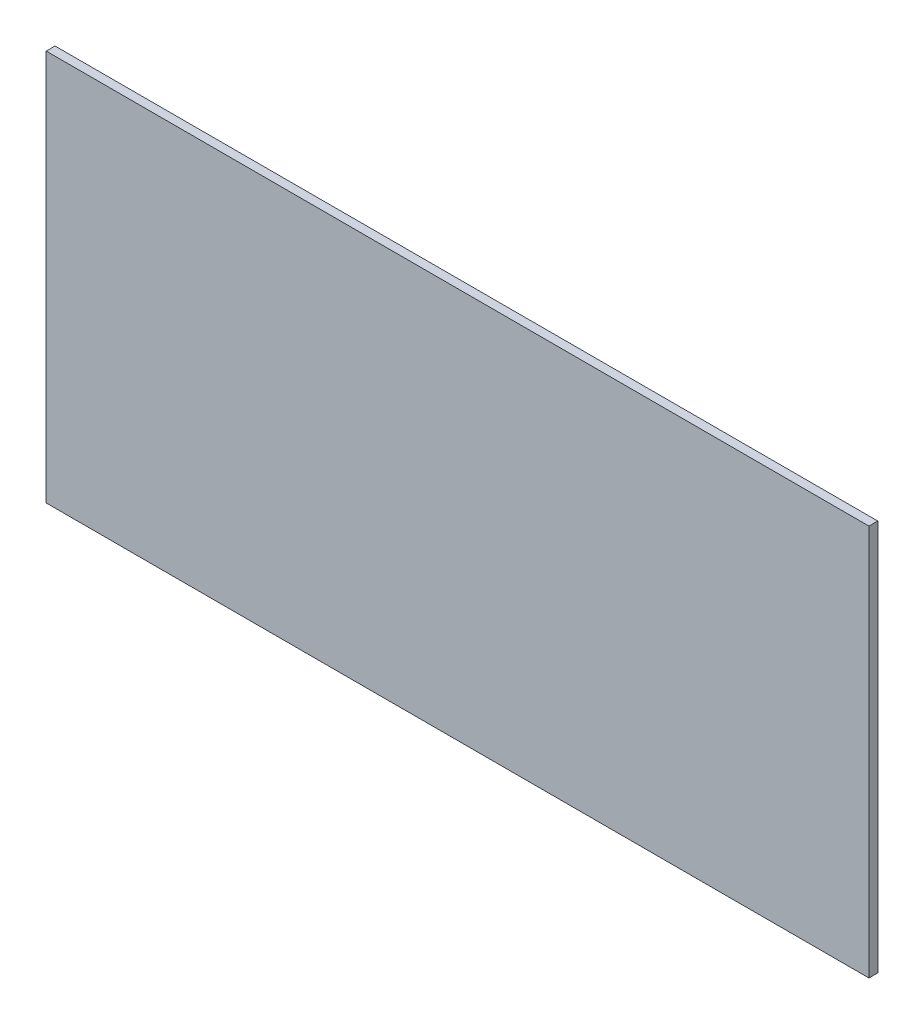
ISO-10303-21;
HEADER;
FILE_DESCRIPTION(('STEP AP214'),'2;1');
FILE_NAME('part.step','',(''),(''),'','','');
FILE_SCHEMA(('AUTOMOTIVE_DESIGN { 1 0 10303 214 1 1 1 1 }'));
ENDSEC;
DATA;
#1=APPLICATION_CONTEXT('core data for automotive mechanical design processes');
#2=APPLICATION_PROTOCOL_DEFINITION('international standard','automotive_design',2000,#1);
#3=PRODUCT_CONTEXT('',#1,'mechanical');
#4=PRODUCT('Part','Part','',(#3));
#5=PRODUCT_RELATED_PRODUCT_CATEGORY('part','',(#4));
#6=PRODUCT_DEFINITION_FORMATION('','',#4);
#7=PRODUCT_DEFINITION_CONTEXT('part definition',#1,'design');
#8=PRODUCT_DEFINITION('design','',#6,#7);
#9=PRODUCT_DEFINITION_SHAPE('','',#8);
#10=(LENGTH_UNIT() NAMED_UNIT(*) SI_UNIT(.MILLI.,.METRE.));
#11=(NAMED_UNIT(*) PLANE_ANGLE_UNIT() SI_UNIT($,.RADIAN.));
#12=(NAMED_UNIT(*) SI_UNIT($,.STERADIAN.) SOLID_ANGLE_UNIT());
#13=UNCERTAINTY_MEASURE_WITH_UNIT(LENGTH_MEASURE(1.E-05),#10,'distance_accuracy_value','');
#14=(GEOMETRIC_REPRESENTATION_CONTEXT(3) GLOBAL_UNCERTAINTY_ASSIGNED_CONTEXT((#13)) GLOBAL_UNIT_ASSIGNED_CONTEXT((#10,
#11,#12)) REPRESENTATION_CONTEXT('',''));
#15=CARTESIAN_POINT('',(0.,0.,0.));
#16=DIRECTION('',(0.,0.,1.));
#17=DIRECTION('',(1.,0.,0.));
#18=AXIS2_PLACEMENT_3D('',#15,#16,#17);
#19=CARTESIAN_POINT('',(233.6,-111.125,5.));
#20=DIRECTION('',(-1.,0.,0.));
#21=DIRECTION('',(0.,0.,1.));
#22=AXIS2_PLACEMENT_3D('',#19,#20,#21);
#23=PLANE('',#22);
#24=DIRECTION('',(0.,1.,0.));
#25=VECTOR('',#24,1.);
#26=CARTESIAN_POINT('',(233.6,-111.125,0.));
#27=LINE('',#26,#25);
#28=CARTESIAN_POINT('',(233.6,-111.125,0.));
#29=VERTEX_POINT('',#28);
#30=CARTESIAN_POINT('',(233.6,111.125,0.));
#31=VERTEX_POINT('',#30);
#32=EDGE_CURVE('E96',#29,#31,#27,.T.);
#33=ORIENTED_EDGE('',*,*,#32,.T.);
#34=DIRECTION('',(0.,0.,-1.));
#35=VECTOR('',#34,1.);
#36=CARTESIAN_POINT('',(233.6,111.125,5.));
#37=LINE('',#36,#35);
#38=CARTESIAN_POINT('',(233.6,111.125,5.));
#39=VERTEX_POINT('',#38);
#40=EDGE_CURVE('E11',#39,#31,#37,.T.);
#41=ORIENTED_EDGE('',*,*,#40,.F.);
#42=DIRECTION('',(0.,1.,0.));
#43=VECTOR('',#42,1.);
#44=CARTESIAN_POINT('',(233.6,-111.125,5.));
#45=LINE('',#44,#43);
#46=CARTESIAN_POINT('',(233.6,-111.125,5.));
#47=VERTEX_POINT('',#46);
#48=EDGE_CURVE('E84',#47,#39,#45,.T.);
#49=ORIENTED_EDGE('',*,*,#48,.F.);
#50=DIRECTION('',(0.,0.,-1.));
#51=VECTOR('',#50,1.);
#52=CARTESIAN_POINT('',(233.6,-111.125,5.));
#53=LINE('',#52,#51);
#54=EDGE_CURVE('E92',#47,#29,#53,.T.);
#55=ORIENTED_EDGE('',*,*,#54,.T.);
#56=EDGE_LOOP('',(#33,#41,#49,#55));
#57=FACE_BOUND('',#56,.T.);
#58=ADVANCED_FACE('F33',(#57),#23,.F.);
#59=CARTESIAN_POINT('',(-233.6,111.125,5.));
#60=DIRECTION('',(0.,-1.,0.));
#61=DIRECTION('',(0.,0.,-1.));
#62=AXIS2_PLACEMENT_3D('',#59,#60,#61);
#63=PLANE('',#62);
#64=DIRECTION('',(-1.,0.,0.));
#65=VECTOR('',#64,1.);
#66=CARTESIAN_POINT('',(-233.6,111.125,0.));
#67=LINE('',#66,#65);
#68=CARTESIAN_POINT('',(-233.6,111.125,0.));
#69=VERTEX_POINT('',#68);
#70=EDGE_CURVE('E88',#31,#69,#67,.T.);
#71=ORIENTED_EDGE('',*,*,#70,.T.);
#72=DIRECTION('',(0.,0.,-1.));
#73=VECTOR('',#72,1.);
#74=CARTESIAN_POINT('',(-233.6,111.125,5.));
#75=LINE('',#74,#73);
#76=CARTESIAN_POINT('',(-233.6,111.125,5.));
#77=VERTEX_POINT('',#76);
#78=EDGE_CURVE('E41',#77,#69,#75,.T.);
#79=ORIENTED_EDGE('',*,*,#78,.F.);
#80=DIRECTION('',(-1.,0.,0.));
#81=VECTOR('',#80,1.);
#82=CARTESIAN_POINT('',(-233.6,111.125,5.));
#83=LINE('',#82,#81);
#84=EDGE_CURVE('E79',#39,#77,#83,.T.);
#85=ORIENTED_EDGE('',*,*,#84,.F.);
#86=ORIENTED_EDGE('',*,*,#40,.T.);
#87=EDGE_LOOP('',(#71,#79,#85,#86));
#88=FACE_BOUND('',#87,.T.);
#89=ADVANCED_FACE('F87',(#88),#63,.F.);
#90=CARTESIAN_POINT('',(-233.6,-111.125,5.));
#91=DIRECTION('',(1.,0.,0.));
#92=DIRECTION('',(0.,0.,-1.));
#93=AXIS2_PLACEMENT_3D('',#90,#91,#92);
#94=PLANE('',#93);
#95=DIRECTION('',(0.,-1.,0.));
#96=VECTOR('',#95,1.);
#97=CARTESIAN_POINT('',(-233.6,-111.125,0.));
#98=LINE('',#97,#96);
#99=CARTESIAN_POINT('',(-233.6,-111.125,0.));
#100=VERTEX_POINT('',#99);
#101=EDGE_CURVE('E66',#69,#100,#98,.T.);
#102=ORIENTED_EDGE('',*,*,#101,.T.);
#103=DIRECTION('',(0.,0.,-1.));
#104=VECTOR('',#103,1.);
#105=CARTESIAN_POINT('',(-233.6,-111.125,5.));
#106=LINE('',#105,#104);
#107=CARTESIAN_POINT('',(-233.6,-111.125,5.));
#108=VERTEX_POINT('',#107);
#109=EDGE_CURVE('E89',#108,#100,#106,.T.);
#110=ORIENTED_EDGE('',*,*,#109,.F.);
#111=DIRECTION('',(0.,-1.,0.));
#112=VECTOR('',#111,1.);
#113=CARTESIAN_POINT('',(-233.6,-111.125,5.));
#114=LINE('',#113,#112);
#115=EDGE_CURVE('E82',#77,#108,#114,.T.);
#116=ORIENTED_EDGE('',*,*,#115,.F.);
#117=ORIENTED_EDGE('',*,*,#78,.T.);
#118=EDGE_LOOP('',(#102,#110,#116,#117));
#119=FACE_BOUND('',#118,.T.);
#120=ADVANCED_FACE('F90',(#119),#94,.F.);
#121=CARTESIAN_POINT('',(-233.6,-111.125,5.));
#122=DIRECTION('',(0.,1.,0.));
#123=DIRECTION('',(0.,0.,1.));
#124=AXIS2_PLACEMENT_3D('',#121,#122,#123);
#125=PLANE('',#124);
#126=DIRECTION('',(1.,0.,0.));
#127=VECTOR('',#126,1.);
#128=CARTESIAN_POINT('',(-233.6,-111.125,0.));
#129=LINE('',#128,#127);
#130=EDGE_CURVE('E72',#100,#29,#129,.T.);
#131=ORIENTED_EDGE('',*,*,#130,.T.);
#132=ORIENTED_EDGE('',*,*,#54,.F.);
#133=DIRECTION('',(1.,0.,0.));
#134=VECTOR('',#133,1.);
#135=CARTESIAN_POINT('',(-233.6,-111.125,5.));
#136=LINE('',#135,#134);
#137=EDGE_CURVE('E49',#108,#47,#136,.T.);
#138=ORIENTED_EDGE('',*,*,#137,.F.);
#139=ORIENTED_EDGE('',*,*,#109,.T.);
#140=EDGE_LOOP('',(#131,#132,#138,#139));
#141=FACE_BOUND('',#140,.T.);
#142=ADVANCED_FACE('F103',(#141),#125,.F.);
#143=CARTESIAN_POINT('',(0.,0.,5.));
#144=DIRECTION('',(0.,0.,-1.));
#145=DIRECTION('',(-1.,0.,0.));
#146=AXIS2_PLACEMENT_3D('',#143,#144,#145);
#147=PLANE('',#146);
#148=ORIENTED_EDGE('',*,*,#48,.T.);
#149=ORIENTED_EDGE('',*,*,#84,.T.);
#150=ORIENTED_EDGE('',*,*,#115,.T.);
#151=ORIENTED_EDGE('',*,*,#137,.T.);
#152=EDGE_LOOP('',(#148,#149,#150,#151));
#153=FACE_BOUND('',#152,.T.);
#154=ADVANCED_FACE('F80',(#153),#147,.F.);
#155=CARTESIAN_POINT('',(0.,0.,0.));
#156=DIRECTION('',(0.,0.,-1.));
#157=DIRECTION('',(-1.,0.,0.));
#158=AXIS2_PLACEMENT_3D('',#155,#156,#157);
#159=PLANE('',#158);
#160=ORIENTED_EDGE('',*,*,#32,.F.);
#161=ORIENTED_EDGE('',*,*,#130,.F.);
#162=ORIENTED_EDGE('',*,*,#101,.F.);
#163=ORIENTED_EDGE('',*,*,#70,.F.);
#164=EDGE_LOOP('',(#160,#161,#162,#163));
#165=FACE_BOUND('',#164,.T.);
#166=ADVANCED_FACE('F106',(#165),#159,.T.);
#167=CLOSED_SHELL('',(#58,#89,#120,#142,#154,#166));
#168=MANIFOLD_SOLID_BREP('B2',#167);
#169=ADVANCED_BREP_SHAPE_REPRESENTATION('',(#18,#168),#14);
#170=SHAPE_DEFINITION_REPRESENTATION(#9,#169);
ENDSEC;
END-ISO-10303-21;
